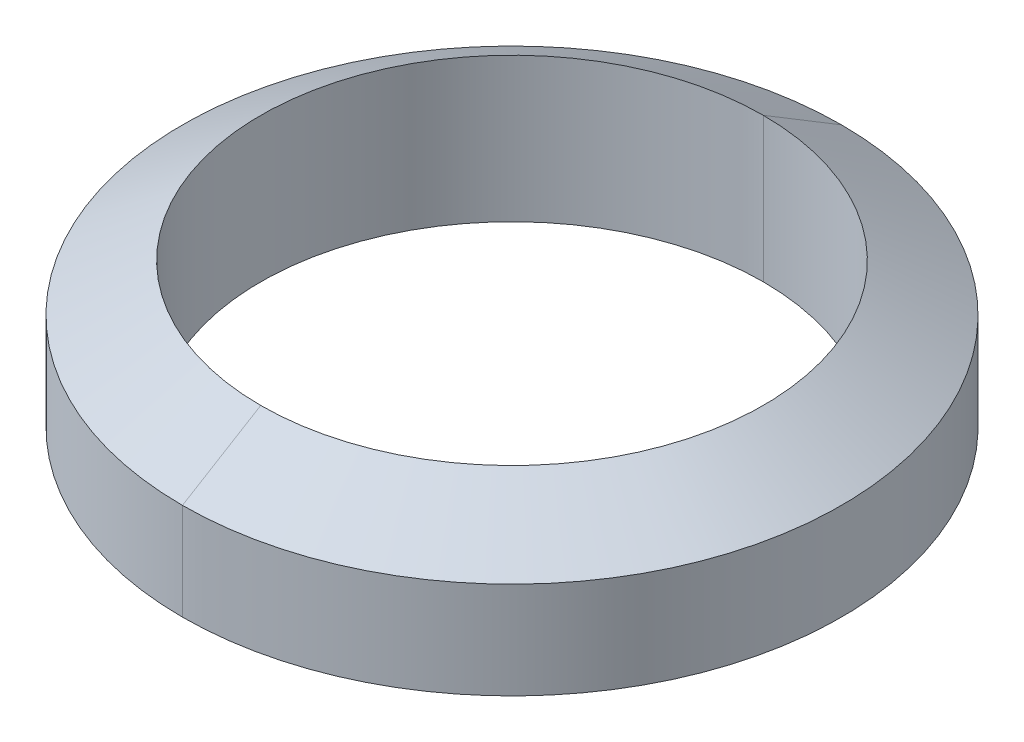
ISO-10303-21;
HEADER;
FILE_DESCRIPTION(('STEP AP214'),'2;1');
FILE_NAME('part.step','',(''),(''),'','','');
FILE_SCHEMA(('AUTOMOTIVE_DESIGN { 1 0 10303 214 1 1 1 1 }'));
ENDSEC;
DATA;
#1=APPLICATION_CONTEXT('core data for automotive mechanical design processes');
#2=APPLICATION_PROTOCOL_DEFINITION('international standard','automotive_design',2000,#1);
#3=PRODUCT_CONTEXT('',#1,'mechanical');
#4=PRODUCT('Part','Part','',(#3));
#5=PRODUCT_RELATED_PRODUCT_CATEGORY('part','',(#4));
#6=PRODUCT_DEFINITION_FORMATION('','',#4);
#7=PRODUCT_DEFINITION_CONTEXT('part definition',#1,'design');
#8=PRODUCT_DEFINITION('design','',#6,#7);
#9=PRODUCT_DEFINITION_SHAPE('','',#8);
#10=(LENGTH_UNIT() NAMED_UNIT(*) SI_UNIT(.MILLI.,.METRE.));
#11=(NAMED_UNIT(*) PLANE_ANGLE_UNIT() SI_UNIT($,.RADIAN.));
#12=(NAMED_UNIT(*) SI_UNIT($,.STERADIAN.) SOLID_ANGLE_UNIT());
#13=UNCERTAINTY_MEASURE_WITH_UNIT(LENGTH_MEASURE(1.E-05),#10,'distance_accuracy_value','');
#14=(GEOMETRIC_REPRESENTATION_CONTEXT(3) GLOBAL_UNCERTAINTY_ASSIGNED_CONTEXT((#13)) GLOBAL_UNIT_ASSIGNED_CONTEXT((#10,
#11,#12)) REPRESENTATION_CONTEXT('',''));
#15=CARTESIAN_POINT('',(0.,0.,0.));
#16=DIRECTION('',(0.,0.,1.));
#17=DIRECTION('',(1.,0.,0.));
#18=AXIS2_PLACEMENT_3D('',#15,#16,#17);
#19=CARTESIAN_POINT('',(-9.00698826646719,-4.48828126797801,54.127124258992));
#20=DIRECTION('',(0.,1.,0.));
#21=DIRECTION('',(1.,0.,0.));
#22=AXIS2_PLACEMENT_3D('',#19,#20,#21);
#23=PLANE('',#22);
#24=CARTESIAN_POINT('',(-2.90698826646719,-4.48828126797801,54.127124258992));
#25=DIRECTION('',(0.,-1.,0.));
#26=DIRECTION('',(0.,0.,-1.));
#27=AXIS2_PLACEMENT_3D('',#24,#25,#26);
#28=CIRCLE('',#27,6.1);
#29=CARTESIAN_POINT('',(-2.90698826646719,-4.48828126797801,48.027124258992));
#30=VERTEX_POINT('',#29);
#31=CARTESIAN_POINT('',(-2.90698826646719,-4.48828126797801,60.227124258992));
#32=VERTEX_POINT('',#31);
#33=EDGE_CURVE('E36',#30,#32,#28,.T.);
#34=ORIENTED_EDGE('',*,*,#33,.F.);
#35=CARTESIAN_POINT('',(-2.90698826646719,-4.48828126797801,54.127124258992));
#36=DIRECTION('',(0.,-1.,0.));
#37=DIRECTION('',(0.,0.,-1.));
#38=AXIS2_PLACEMENT_3D('',#35,#36,#37);
#39=CIRCLE('',#38,6.1);
#40=EDGE_CURVE('E121',#32,#30,#39,.T.);
#41=ORIENTED_EDGE('',*,*,#40,.F.);
#42=EDGE_LOOP('',(#34,#41));
#43=FACE_BOUND('',#42,.T.);
#44=CARTESIAN_POINT('',(-2.90698826646719,-4.48828126797801,54.127124258992));
#45=DIRECTION('',(0.,-1.,0.));
#46=DIRECTION('',(0.,0.,-1.));
#47=AXIS2_PLACEMENT_3D('',#44,#45,#46);
#48=CIRCLE('',#47,8.);
#49=CARTESIAN_POINT('',(-2.90698826646719,-4.48828126797801,46.127124258992));
#50=VERTEX_POINT('',#49);
#51=CARTESIAN_POINT('',(-2.90698826646719,-4.48828126797801,62.1271242589921));
#52=VERTEX_POINT('',#51);
#53=EDGE_CURVE('E104',#50,#52,#48,.T.);
#54=ORIENTED_EDGE('',*,*,#53,.T.);
#55=CARTESIAN_POINT('',(-2.90698826646719,-4.48828126797801,54.127124258992));
#56=DIRECTION('',(0.,-1.,0.));
#57=DIRECTION('',(0.,0.,-1.));
#58=AXIS2_PLACEMENT_3D('',#55,#56,#57);
#59=CIRCLE('',#58,8.);
#60=EDGE_CURVE('E11',#52,#50,#59,.T.);
#61=ORIENTED_EDGE('',*,*,#60,.T.);
#62=EDGE_LOOP('',(#54,#61));
#63=FACE_BOUND('',#62,.T.);
#64=ADVANCED_FACE('F17',(#43,#63),#23,.F.);
#65=CARTESIAN_POINT('',(-2.90698826646719,-4.48828126797801,54.127124258992));
#66=DIRECTION('',(0.,-1.,0.));
#67=DIRECTION('',(0.,0.,1.));
#68=AXIS2_PLACEMENT_3D('',#65,#66,#67);
#69=CYLINDRICAL_SURFACE('',#68,8.);
#70=DIRECTION('',(0.,-1.,0.));
#71=VECTOR('',#70,1.);
#72=CARTESIAN_POINT('',(-2.90698826646719,-4.48828126797801,62.1271242589921));
#73=LINE('',#72,#71);
#74=CARTESIAN_POINT('',(-2.90698826646719,-2.13828126797801,62.1271242589921));
#75=VERTEX_POINT('',#74);
#76=EDGE_CURVE('E84',#75,#52,#73,.T.);
#77=ORIENTED_EDGE('',*,*,#76,.F.);
#78=CARTESIAN_POINT('',(-2.90698826646719,-2.13828126797801,54.127124258992));
#79=DIRECTION('',(0.,-1.,0.));
#80=DIRECTION('',(0.,0.,-1.));
#81=AXIS2_PLACEMENT_3D('',#78,#79,#80);
#82=CIRCLE('',#81,8.);
#83=CARTESIAN_POINT('',(-2.90698826646719,-2.13828126797801,46.127124258992));
#84=VERTEX_POINT('',#83);
#85=EDGE_CURVE('E20',#75,#84,#82,.T.);
#86=ORIENTED_EDGE('',*,*,#85,.T.);
#87=DIRECTION('',(0.,-1.,0.));
#88=VECTOR('',#87,1.);
#89=CARTESIAN_POINT('',(-2.90698826646719,-4.48828126797801,46.127124258992));
#90=LINE('',#89,#88);
#91=EDGE_CURVE('E81',#84,#50,#90,.T.);
#92=ORIENTED_EDGE('',*,*,#91,.T.);
#93=ORIENTED_EDGE('',*,*,#60,.F.);
#94=EDGE_LOOP('',(#77,#86,#92,#93));
#95=FACE_BOUND('',#94,.T.);
#96=ADVANCED_FACE('F79',(#95),#69,.T.);
#97=CARTESIAN_POINT('',(-2.90698826646719,-0.987600366692464,54.127124258992));
#98=DIRECTION('',(0.,-1.,0.));
#99=DIRECTION('',(0.,0.,1.));
#100=AXIS2_PLACEMENT_3D('',#97,#98,#99);
#101=CONICAL_SURFACE('',#100,6.1,1.026253599);
#102=DIRECTION('',(0.,-0.518027009373128,0.855364260160508));
#103=VECTOR('',#102,1.);
#104=CARTESIAN_POINT('',(-2.90698826646719,-0.987600366692464,60.227124258992));
#105=LINE('',#104,#103);
#106=CARTESIAN_POINT('',(-2.90698826646719,-0.987600366692464,60.227124258992));
#107=VERTEX_POINT('',#106);
#108=EDGE_CURVE('E99',#107,#75,#105,.T.);
#109=ORIENTED_EDGE('',*,*,#108,.F.);
#110=CARTESIAN_POINT('',(-2.90698826646719,-0.987600366692464,54.127124258992));
#111=DIRECTION('',(0.,-1.,0.));
#112=DIRECTION('',(0.,0.,-1.));
#113=AXIS2_PLACEMENT_3D('',#110,#111,#112);
#114=CIRCLE('',#113,6.1);
#115=CARTESIAN_POINT('',(-2.90698826646719,-0.987600366692464,48.027124258992));
#116=VERTEX_POINT('',#115);
#117=EDGE_CURVE('E93',#107,#116,#114,.T.);
#118=ORIENTED_EDGE('',*,*,#117,.T.);
#119=DIRECTION('',(0.,-0.518027009373128,-0.855364260160508));
#120=VECTOR('',#119,1.);
#121=CARTESIAN_POINT('',(-2.90698826646719,-0.987600366692464,48.027124258992));
#122=LINE('',#121,#120);
#123=EDGE_CURVE('E91',#116,#84,#122,.T.);
#124=ORIENTED_EDGE('',*,*,#123,.T.);
#125=ORIENTED_EDGE('',*,*,#85,.F.);
#126=EDGE_LOOP('',(#109,#118,#124,#125));
#127=FACE_BOUND('',#126,.T.);
#128=ADVANCED_FACE('F92',(#127),#101,.T.);
#129=CARTESIAN_POINT('',(-2.90698826646719,-4.48828126797801,54.127124258992));
#130=DIRECTION('',(0.,-1.,0.));
#131=DIRECTION('',(0.,0.,1.));
#132=AXIS2_PLACEMENT_3D('',#129,#130,#131);
#133=CYLINDRICAL_SURFACE('',#132,6.1);
#134=DIRECTION('',(0.,-1.,0.));
#135=VECTOR('',#134,1.);
#136=CARTESIAN_POINT('',(-2.90698826646719,-4.48828126797801,60.227124258992));
#137=LINE('',#136,#135);
#138=EDGE_CURVE('E117',#107,#32,#137,.T.);
#139=ORIENTED_EDGE('',*,*,#138,.F.);
#140=CARTESIAN_POINT('',(-2.90698826646719,-0.987600366692464,54.127124258992));
#141=DIRECTION('',(0.,-1.,0.));
#142=DIRECTION('',(0.,0.,-1.));
#143=AXIS2_PLACEMENT_3D('',#140,#141,#142);
#144=CIRCLE('',#143,6.1);
#145=EDGE_CURVE('E106',#116,#107,#144,.T.);
#146=ORIENTED_EDGE('',*,*,#145,.F.);
#147=DIRECTION('',(0.,-1.,0.));
#148=VECTOR('',#147,1.);
#149=CARTESIAN_POINT('',(-2.90698826646719,-4.48828126797801,48.027124258992));
#150=LINE('',#149,#148);
#151=EDGE_CURVE('E56',#116,#30,#150,.T.);
#152=ORIENTED_EDGE('',*,*,#151,.T.);
#153=ORIENTED_EDGE('',*,*,#33,.T.);
#154=EDGE_LOOP('',(#139,#146,#152,#153));
#155=FACE_BOUND('',#154,.T.);
#156=ADVANCED_FACE('F142',(#155),#133,.F.);
#157=CARTESIAN_POINT('',(-2.90698826646719,-4.48828126797801,54.127124258992));
#158=DIRECTION('',(0.,-1.,0.));
#159=DIRECTION('',(0.,0.,1.));
#160=AXIS2_PLACEMENT_3D('',#157,#158,#159);
#161=CYLINDRICAL_SURFACE('',#160,6.1);
#162=ORIENTED_EDGE('',*,*,#117,.F.);
#163=ORIENTED_EDGE('',*,*,#138,.T.);
#164=ORIENTED_EDGE('',*,*,#40,.T.);
#165=ORIENTED_EDGE('',*,*,#151,.F.);
#166=EDGE_LOOP('',(#162,#163,#164,#165));
#167=FACE_BOUND('',#166,.T.);
#168=ADVANCED_FACE('F133',(#167),#161,.F.);
#169=CARTESIAN_POINT('',(-2.90698826646719,-0.987600366692464,54.127124258992));
#170=DIRECTION('',(0.,-1.,0.));
#171=DIRECTION('',(0.,0.,1.));
#172=AXIS2_PLACEMENT_3D('',#169,#170,#171);
#173=CONICAL_SURFACE('',#172,6.1,1.026253599);
#174=ORIENTED_EDGE('',*,*,#145,.T.);
#175=ORIENTED_EDGE('',*,*,#108,.T.);
#176=CARTESIAN_POINT('',(-2.90698826646719,-2.13828126797801,54.127124258992));
#177=DIRECTION('',(0.,-1.,0.));
#178=DIRECTION('',(0.,0.,-1.));
#179=AXIS2_PLACEMENT_3D('',#176,#177,#178);
#180=CIRCLE('',#179,8.);
#181=EDGE_CURVE('E103',#84,#75,#180,.T.);
#182=ORIENTED_EDGE('',*,*,#181,.F.);
#183=ORIENTED_EDGE('',*,*,#123,.F.);
#184=EDGE_LOOP('',(#174,#175,#182,#183));
#185=FACE_BOUND('',#184,.T.);
#186=ADVANCED_FACE('F108',(#185),#173,.T.);
#187=CARTESIAN_POINT('',(-2.90698826646719,-4.48828126797801,54.127124258992));
#188=DIRECTION('',(0.,-1.,0.));
#189=DIRECTION('',(0.,0.,1.));
#190=AXIS2_PLACEMENT_3D('',#187,#188,#189);
#191=CYLINDRICAL_SURFACE('',#190,8.);
#192=ORIENTED_EDGE('',*,*,#181,.T.);
#193=ORIENTED_EDGE('',*,*,#76,.T.);
#194=ORIENTED_EDGE('',*,*,#53,.F.);
#195=ORIENTED_EDGE('',*,*,#91,.F.);
#196=EDGE_LOOP('',(#192,#193,#194,#195));
#197=FACE_BOUND('',#196,.T.);
#198=ADVANCED_FACE('F102',(#197),#191,.T.);
#199=CLOSED_SHELL('',(#64,#96,#128,#156,#168,#186,#198));
#200=MANIFOLD_SOLID_BREP('B1',#199);
#201=ADVANCED_BREP_SHAPE_REPRESENTATION('',(#18,#200),#14);
#202=SHAPE_DEFINITION_REPRESENTATION(#9,#201);
ENDSEC;
END-ISO-10303-21;
